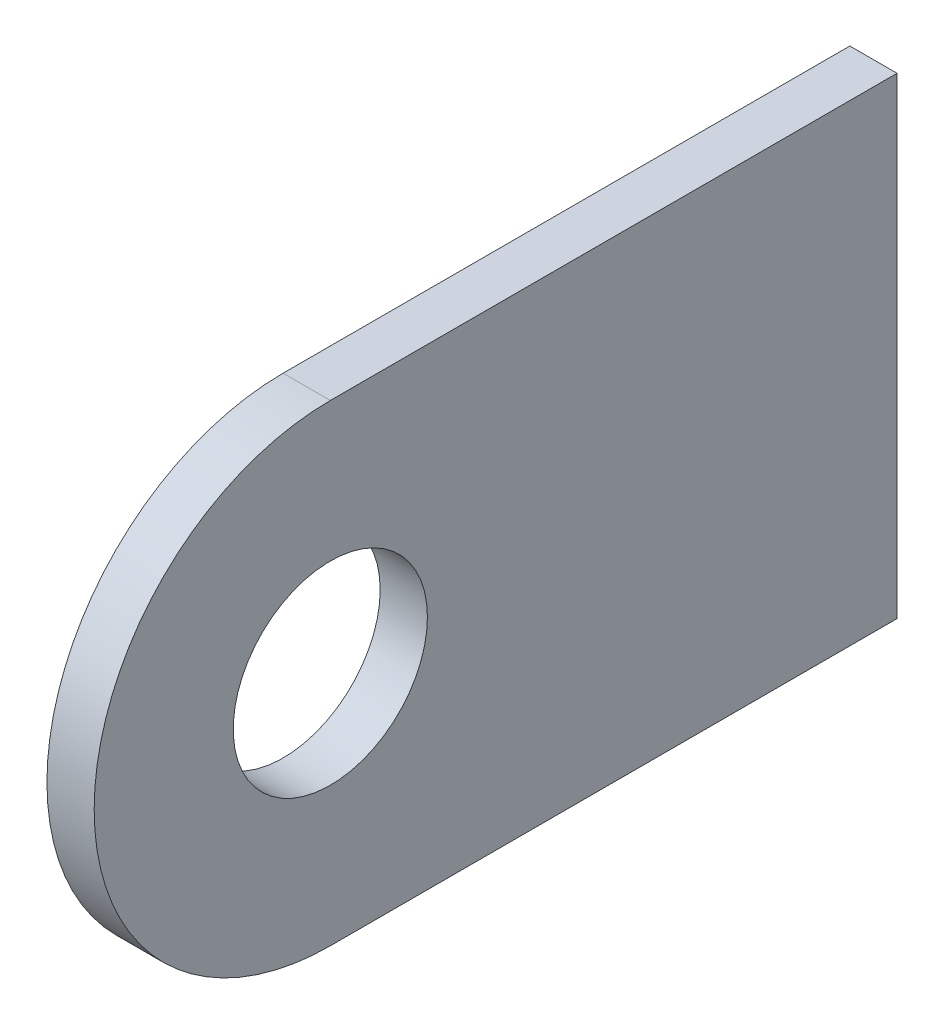
ISO-10303-21;
HEADER;
FILE_DESCRIPTION(('STEP AP214'),'2;1');
FILE_NAME('part.step','',(''),(''),'','','');
FILE_SCHEMA(('AUTOMOTIVE_DESIGN { 1 0 10303 214 1 1 1 1 }'));
ENDSEC;
DATA;
#1=APPLICATION_CONTEXT('core data for automotive mechanical design processes');
#2=APPLICATION_PROTOCOL_DEFINITION('international standard','automotive_design',2000,#1);
#3=PRODUCT_CONTEXT('',#1,'mechanical');
#4=PRODUCT('Part','Part','',(#3));
#5=PRODUCT_RELATED_PRODUCT_CATEGORY('part','',(#4));
#6=PRODUCT_DEFINITION_FORMATION('','',#4);
#7=PRODUCT_DEFINITION_CONTEXT('part definition',#1,'design');
#8=PRODUCT_DEFINITION('design','',#6,#7);
#9=PRODUCT_DEFINITION_SHAPE('','',#8);
#10=(LENGTH_UNIT() NAMED_UNIT(*) SI_UNIT(.MILLI.,.METRE.));
#11=(NAMED_UNIT(*) PLANE_ANGLE_UNIT() SI_UNIT($,.RADIAN.));
#12=(NAMED_UNIT(*) SI_UNIT($,.STERADIAN.) SOLID_ANGLE_UNIT());
#13=UNCERTAINTY_MEASURE_WITH_UNIT(LENGTH_MEASURE(1.E-05),#10,'distance_accuracy_value','');
#14=(GEOMETRIC_REPRESENTATION_CONTEXT(3) GLOBAL_UNCERTAINTY_ASSIGNED_CONTEXT((#13)) GLOBAL_UNIT_ASSIGNED_CONTEXT((#10,
#11,#12)) REPRESENTATION_CONTEXT('',''));
#15=CARTESIAN_POINT('',(0.,0.,0.));
#16=DIRECTION('',(0.,0.,1.));
#17=DIRECTION('',(1.,0.,0.));
#18=AXIS2_PLACEMENT_3D('',#15,#16,#17);
#19=CARTESIAN_POINT('',(1.5875,7.93749999999761,15.875));
#20=DIRECTION('',(0.,-1.,0.));
#21=DIRECTION('',(0.,0.,-1.));
#22=AXIS2_PLACEMENT_3D('',#19,#20,#21);
#23=PLANE('',#22);
#24=DIRECTION('',(0.,0.,1.));
#25=VECTOR('',#24,1.);
#26=CARTESIAN_POINT('',(0.,7.93749999999761,15.875));
#27=LINE('',#26,#25);
#28=CARTESIAN_POINT('',(0.,7.9374999999976,-3.175));
#29=VERTEX_POINT('',#28);
#30=CARTESIAN_POINT('',(0.,7.93749999999761,15.875));
#31=VERTEX_POINT('',#30);
#32=EDGE_CURVE('E102',#29,#31,#27,.T.);
#33=ORIENTED_EDGE('',*,*,#32,.T.);
#34=DIRECTION('',(-1.,0.,0.));
#35=VECTOR('',#34,1.);
#36=CARTESIAN_POINT('',(1.5875,7.93749999999761,15.875));
#37=LINE('',#36,#35);
#38=CARTESIAN_POINT('',(1.5875,7.93749999999761,15.875));
#39=VERTEX_POINT('',#38);
#40=EDGE_CURVE('E11',#39,#31,#37,.T.);
#41=ORIENTED_EDGE('',*,*,#40,.F.);
#42=DIRECTION('',(0.,0.,1.));
#43=VECTOR('',#42,1.);
#44=CARTESIAN_POINT('',(1.5875,7.93749999999761,15.875));
#45=LINE('',#44,#43);
#46=CARTESIAN_POINT('',(1.5875,7.9374999999976,-3.175));
#47=VERTEX_POINT('',#46);
#48=EDGE_CURVE('E90',#47,#39,#45,.T.);
#49=ORIENTED_EDGE('',*,*,#48,.F.);
#50=DIRECTION('',(-1.,0.,0.));
#51=VECTOR('',#50,1.);
#52=CARTESIAN_POINT('',(1.5875,7.9374999999976,-3.175));
#53=LINE('',#52,#51);
#54=EDGE_CURVE('E98',#47,#29,#53,.T.);
#55=ORIENTED_EDGE('',*,*,#54,.T.);
#56=EDGE_LOOP('',(#33,#41,#49,#55));
#57=FACE_BOUND('',#56,.T.);
#58=ADVANCED_FACE('F39',(#57),#23,.F.);
#59=CARTESIAN_POINT('',(1.5875,0.,15.875));
#60=DIRECTION('',(-1.,0.,0.));
#61=DIRECTION('',(0.,0.,1.));
#62=AXIS2_PLACEMENT_3D('',#59,#60,#61);
#63=CYLINDRICAL_SURFACE('',#62,7.93749999999761);
#64=CARTESIAN_POINT('',(0.,0.,15.875));
#65=DIRECTION('',(1.,0.,0.));
#66=DIRECTION('',(0.,0.,1.));
#67=AXIS2_PLACEMENT_3D('',#64,#65,#66);
#68=CIRCLE('',#67,7.93749999999761);
#69=CARTESIAN_POINT('',(0.,-7.93749999999761,15.875));
#70=VERTEX_POINT('',#69);
#71=EDGE_CURVE('E94',#31,#70,#68,.T.);
#72=ORIENTED_EDGE('',*,*,#71,.T.);
#73=DIRECTION('',(-1.,0.,0.));
#74=VECTOR('',#73,1.);
#75=CARTESIAN_POINT('',(1.5875,-7.93749999999761,15.875));
#76=LINE('',#75,#74);
#77=CARTESIAN_POINT('',(1.5875,-7.93749999999761,15.875));
#78=VERTEX_POINT('',#77);
#79=EDGE_CURVE('E47',#78,#70,#76,.T.);
#80=ORIENTED_EDGE('',*,*,#79,.F.);
#81=CARTESIAN_POINT('',(1.5875,0.,15.875));
#82=DIRECTION('',(1.,0.,0.));
#83=DIRECTION('',(0.,0.,1.));
#84=AXIS2_PLACEMENT_3D('',#81,#82,#83);
#85=CIRCLE('',#84,7.93749999999761);
#86=EDGE_CURVE('E85',#39,#78,#85,.T.);
#87=ORIENTED_EDGE('',*,*,#86,.F.);
#88=ORIENTED_EDGE('',*,*,#40,.T.);
#89=EDGE_LOOP('',(#72,#80,#87,#88));
#90=FACE_BOUND('',#89,.T.);
#91=ADVANCED_FACE('F93',(#90),#63,.T.);
#92=CARTESIAN_POINT('',(1.5875,-7.93749999999761,15.875));
#93=DIRECTION('',(0.,1.,0.));
#94=DIRECTION('',(0.,0.,1.));
#95=AXIS2_PLACEMENT_3D('',#92,#93,#94);
#96=PLANE('',#95);
#97=DIRECTION('',(0.,0.,-1.));
#98=VECTOR('',#97,1.);
#99=CARTESIAN_POINT('',(0.,-7.93749999999761,15.875));
#100=LINE('',#99,#98);
#101=CARTESIAN_POINT('',(0.,-7.93749999999761,-3.175));
#102=VERTEX_POINT('',#101);
#103=EDGE_CURVE('E72',#70,#102,#100,.T.);
#104=ORIENTED_EDGE('',*,*,#103,.T.);
#105=DIRECTION('',(-1.,0.,0.));
#106=VECTOR('',#105,1.);
#107=CARTESIAN_POINT('',(1.5875,-7.93749999999761,-3.175));
#108=LINE('',#107,#106);
#109=CARTESIAN_POINT('',(1.5875,-7.93749999999761,-3.175));
#110=VERTEX_POINT('',#109);
#111=EDGE_CURVE('E95',#110,#102,#108,.T.);
#112=ORIENTED_EDGE('',*,*,#111,.F.);
#113=DIRECTION('',(0.,0.,-1.));
#114=VECTOR('',#113,1.);
#115=CARTESIAN_POINT('',(1.5875,-7.93749999999761,15.875));
#116=LINE('',#115,#114);
#117=EDGE_CURVE('E88',#78,#110,#116,.T.);
#118=ORIENTED_EDGE('',*,*,#117,.F.);
#119=ORIENTED_EDGE('',*,*,#79,.T.);
#120=EDGE_LOOP('',(#104,#112,#118,#119));
#121=FACE_BOUND('',#120,.T.);
#122=ADVANCED_FACE('F96',(#121),#96,.F.);
#123=CARTESIAN_POINT('',(1.5875,-7.93749999999761,-3.175));
#124=DIRECTION('',(0.,0.,1.));
#125=DIRECTION('',(1.,0.,0.));
#126=AXIS2_PLACEMENT_3D('',#123,#124,#125);
#127=PLANE('',#126);
#128=DIRECTION('',(0.,1.,0.));
#129=VECTOR('',#128,1.);
#130=CARTESIAN_POINT('',(0.,-7.93749999999761,-3.175));
#131=LINE('',#130,#129);
#132=EDGE_CURVE('E78',#102,#29,#131,.T.);
#133=ORIENTED_EDGE('',*,*,#132,.T.);
#134=ORIENTED_EDGE('',*,*,#54,.F.);
#135=DIRECTION('',(0.,1.,0.));
#136=VECTOR('',#135,1.);
#137=CARTESIAN_POINT('',(1.5875,-7.93749999999761,-3.175));
#138=LINE('',#137,#136);
#139=EDGE_CURVE('E55',#110,#47,#138,.T.);
#140=ORIENTED_EDGE('',*,*,#139,.F.);
#141=ORIENTED_EDGE('',*,*,#111,.T.);
#142=EDGE_LOOP('',(#133,#134,#140,#141));
#143=FACE_BOUND('',#142,.T.);
#144=ADVANCED_FACE('F110',(#143),#127,.F.);
#145=CARTESIAN_POINT('',(1.5875,0.,15.875));
#146=DIRECTION('',(-1.,0.,0.));
#147=DIRECTION('',(0.,0.,1.));
#148=AXIS2_PLACEMENT_3D('',#145,#146,#147);
#149=PLANE('',#148);
#150=CARTESIAN_POINT('',(1.5875,0.,15.875));
#151=DIRECTION('',(1.,0.,0.));
#152=DIRECTION('',(0.,0.,-1.));
#153=AXIS2_PLACEMENT_3D('',#150,#151,#152);
#154=CIRCLE('',#153,3.2639);
#155=CARTESIAN_POINT('',(1.5875,0.,12.6111));
#156=VERTEX_POINT('',#155);
#157=EDGE_CURVE('E118',#156,#156,#154,.T.);
#158=ORIENTED_EDGE('',*,*,#157,.F.);
#159=EDGE_LOOP('',(#158));
#160=FACE_BOUND('',#159,.T.);
#161=ORIENTED_EDGE('',*,*,#48,.T.);
#162=ORIENTED_EDGE('',*,*,#86,.T.);
#163=ORIENTED_EDGE('',*,*,#117,.T.);
#164=ORIENTED_EDGE('',*,*,#139,.T.);
#165=EDGE_LOOP('',(#161,#162,#163,#164));
#166=FACE_BOUND('',#165,.T.);
#167=ADVANCED_FACE('F86',(#160,#166),#149,.F.);
#168=CARTESIAN_POINT('',(0.,0.,15.875));
#169=DIRECTION('',(-1.,0.,0.));
#170=DIRECTION('',(0.,0.,1.));
#171=AXIS2_PLACEMENT_3D('',#168,#169,#170);
#172=PLANE('',#171);
#173=CARTESIAN_POINT('',(0.,0.,15.875));
#174=DIRECTION('',(1.,0.,0.));
#175=DIRECTION('',(0.,0.,-1.));
#176=AXIS2_PLACEMENT_3D('',#173,#174,#175);
#177=CIRCLE('',#176,3.2639);
#178=CARTESIAN_POINT('',(0.,0.,12.6111));
#179=VERTEX_POINT('',#178);
#180=EDGE_CURVE('E105',#179,#179,#177,.T.);
#181=ORIENTED_EDGE('',*,*,#180,.T.);
#182=EDGE_LOOP('',(#181));
#183=FACE_BOUND('',#182,.T.);
#184=ORIENTED_EDGE('',*,*,#32,.F.);
#185=ORIENTED_EDGE('',*,*,#132,.F.);
#186=ORIENTED_EDGE('',*,*,#103,.F.);
#187=ORIENTED_EDGE('',*,*,#71,.F.);
#188=EDGE_LOOP('',(#184,#185,#186,#187));
#189=FACE_BOUND('',#188,.T.);
#190=ADVANCED_FACE('F113',(#183,#189),#172,.T.);
#191=CARTESIAN_POINT('',(1.5875,0.,15.875));
#192=DIRECTION('',(1.,0.,0.));
#193=DIRECTION('',(0.,0.,-1.));
#194=AXIS2_PLACEMENT_3D('',#191,#192,#193);
#195=CYLINDRICAL_SURFACE('',#194,3.2639);
#196=ORIENTED_EDGE('',*,*,#180,.F.);
#197=EDGE_LOOP('',(#196));
#198=FACE_BOUND('',#197,.T.);
#199=ORIENTED_EDGE('',*,*,#157,.T.);
#200=EDGE_LOOP('',(#199));
#201=FACE_BOUND('',#200,.T.);
#202=ADVANCED_FACE('F122',(#198,#201),#195,.F.);
#203=CLOSED_SHELL('',(#58,#91,#122,#144,#167,#190,#202));
#204=MANIFOLD_SOLID_BREP('B2',#203);
#205=ADVANCED_BREP_SHAPE_REPRESENTATION('',(#18,#204),#14);
#206=SHAPE_DEFINITION_REPRESENTATION(#9,#205);
ENDSEC;
END-ISO-10303-21;
